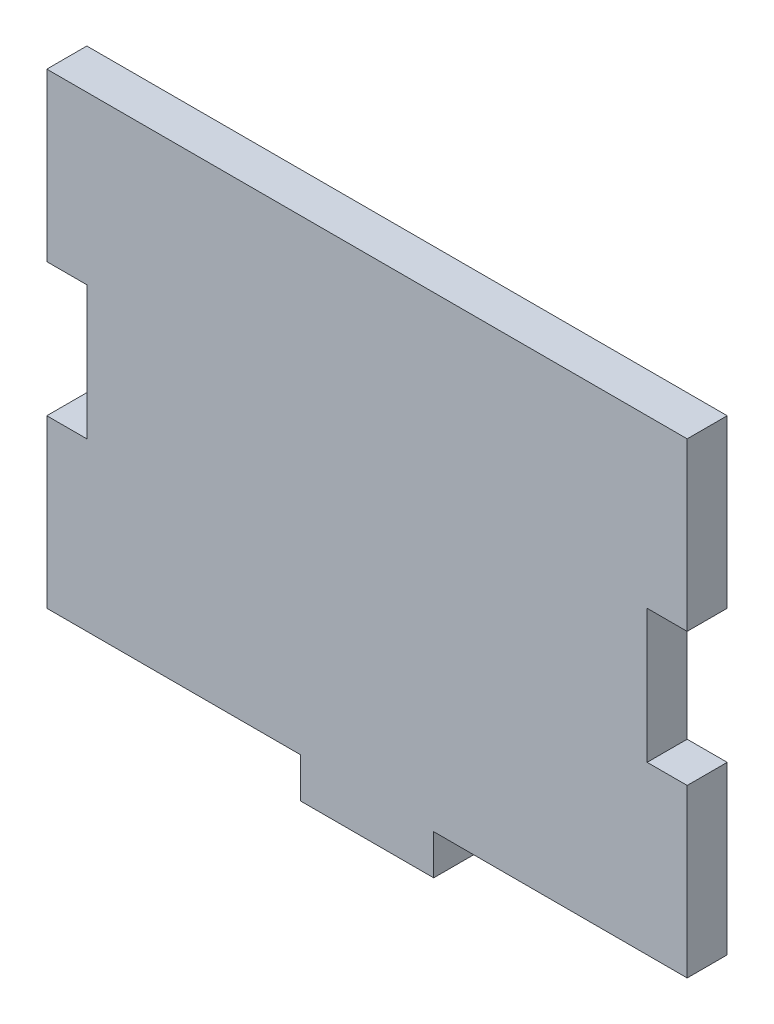
ISO-10303-21;
HEADER;
FILE_DESCRIPTION(('STEP AP214'),'2;1');
FILE_NAME('part.step','',(''),(''),'','','');
FILE_SCHEMA(('AUTOMOTIVE_DESIGN { 1 0 10303 214 1 1 1 1 }'));
ENDSEC;
DATA;
#1=APPLICATION_CONTEXT('core data for automotive mechanical design processes');
#2=APPLICATION_PROTOCOL_DEFINITION('international standard','automotive_design',2000,#1);
#3=PRODUCT_CONTEXT('',#1,'mechanical');
#4=PRODUCT('Part','Part','',(#3));
#5=PRODUCT_RELATED_PRODUCT_CATEGORY('part','',(#4));
#6=PRODUCT_DEFINITION_FORMATION('','',#4);
#7=PRODUCT_DEFINITION_CONTEXT('part definition',#1,'design');
#8=PRODUCT_DEFINITION('design','',#6,#7);
#9=PRODUCT_DEFINITION_SHAPE('','',#8);
#10=(LENGTH_UNIT() NAMED_UNIT(*) SI_UNIT(.MILLI.,.METRE.));
#11=(NAMED_UNIT(*) PLANE_ANGLE_UNIT() SI_UNIT($,.RADIAN.));
#12=(NAMED_UNIT(*) SI_UNIT($,.STERADIAN.) SOLID_ANGLE_UNIT());
#13=UNCERTAINTY_MEASURE_WITH_UNIT(LENGTH_MEASURE(1.E-05),#10,'distance_accuracy_value','');
#14=(GEOMETRIC_REPRESENTATION_CONTEXT(3) GLOBAL_UNCERTAINTY_ASSIGNED_CONTEXT((#13)) GLOBAL_UNIT_ASSIGNED_CONTEXT((#10,
#11,#12)) REPRESENTATION_CONTEXT('',''));
#15=CARTESIAN_POINT('',(0.,0.,0.));
#16=DIRECTION('',(0.,0.,1.));
#17=DIRECTION('',(1.,0.,0.));
#18=AXIS2_PLACEMENT_3D('',#15,#16,#17);
#19=CARTESIAN_POINT('',(-24.,5.00000000000001,3.));
#20=DIRECTION('',(1.,0.,0.));
#21=DIRECTION('',(0.,0.,-1.));
#22=AXIS2_PLACEMENT_3D('',#19,#20,#21);
#23=PLANE('',#22);
#24=DIRECTION('',(0.,-1.,0.));
#25=VECTOR('',#24,1.);
#26=CARTESIAN_POINT('',(-24.,5.00000000000001,0.));
#27=LINE('',#26,#25);
#28=CARTESIAN_POINT('',(-24.,17.5,0.));
#29=VERTEX_POINT('',#28);
#30=CARTESIAN_POINT('',(-24.,5.00000000000001,0.));
#31=VERTEX_POINT('',#30);
#32=EDGE_CURVE('E176',#29,#31,#27,.T.);
#33=ORIENTED_EDGE('',*,*,#32,.T.);
#34=DIRECTION('',(0.,0.,-1.));
#35=VECTOR('',#34,1.);
#36=CARTESIAN_POINT('',(-24.,5.00000000000001,3.));
#37=LINE('',#36,#35);
#38=CARTESIAN_POINT('',(-24.,5.00000000000001,3.));
#39=VERTEX_POINT('',#38);
#40=EDGE_CURVE('E11',#39,#31,#37,.T.);
#41=ORIENTED_EDGE('',*,*,#40,.F.);
#42=DIRECTION('',(0.,-1.,0.));
#43=VECTOR('',#42,1.);
#44=CARTESIAN_POINT('',(-24.,5.00000000000001,3.));
#45=LINE('',#44,#43);
#46=CARTESIAN_POINT('',(-24.,17.5,3.));
#47=VERTEX_POINT('',#46);
#48=EDGE_CURVE('E206',#47,#39,#45,.T.);
#49=ORIENTED_EDGE('',*,*,#48,.F.);
#50=DIRECTION('',(0.,0.,-1.));
#51=VECTOR('',#50,1.);
#52=CARTESIAN_POINT('',(-24.,17.5,3.));
#53=LINE('',#52,#51);
#54=EDGE_CURVE('E172',#47,#29,#53,.T.);
#55=ORIENTED_EDGE('',*,*,#54,.T.);
#56=EDGE_LOOP('',(#33,#41,#49,#55));
#57=FACE_BOUND('',#56,.T.);
#58=ADVANCED_FACE('F32',(#57),#23,.F.);
#59=CARTESIAN_POINT('',(-21.,5.00000000000001,3.));
#60=DIRECTION('',(0.,1.,0.));
#61=DIRECTION('',(0.,0.,1.));
#62=AXIS2_PLACEMENT_3D('',#59,#60,#61);
#63=PLANE('',#62);
#64=DIRECTION('',(1.,0.,0.));
#65=VECTOR('',#64,1.);
#66=CARTESIAN_POINT('',(-21.,5.00000000000001,0.));
#67=LINE('',#66,#65);
#68=CARTESIAN_POINT('',(-21.,5.00000000000001,0.));
#69=VERTEX_POINT('',#68);
#70=EDGE_CURVE('E179',#31,#69,#67,.T.);
#71=ORIENTED_EDGE('',*,*,#70,.T.);
#72=DIRECTION('',(0.,0.,-1.));
#73=VECTOR('',#72,1.);
#74=CARTESIAN_POINT('',(-21.,5.00000000000001,3.));
#75=LINE('',#74,#73);
#76=CARTESIAN_POINT('',(-21.,5.00000000000001,3.));
#77=VERTEX_POINT('',#76);
#78=EDGE_CURVE('E40',#77,#69,#75,.T.);
#79=ORIENTED_EDGE('',*,*,#78,.F.);
#80=DIRECTION('',(1.,0.,0.));
#81=VECTOR('',#80,1.);
#82=CARTESIAN_POINT('',(-21.,5.00000000000001,3.));
#83=LINE('',#82,#81);
#84=EDGE_CURVE('E115',#39,#77,#83,.T.);
#85=ORIENTED_EDGE('',*,*,#84,.F.);
#86=ORIENTED_EDGE('',*,*,#40,.T.);
#87=EDGE_LOOP('',(#71,#79,#85,#86));
#88=FACE_BOUND('',#87,.T.);
#89=ADVANCED_FACE('F304',(#88),#63,.F.);
#90=CARTESIAN_POINT('',(-21.,-4.99999999999999,3.));
#91=DIRECTION('',(1.,0.,0.));
#92=DIRECTION('',(0.,0.,-1.));
#93=AXIS2_PLACEMENT_3D('',#90,#91,#92);
#94=PLANE('',#93);
#95=DIRECTION('',(0.,-1.,0.));
#96=VECTOR('',#95,1.);
#97=CARTESIAN_POINT('',(-21.,-4.99999999999999,0.));
#98=LINE('',#97,#96);
#99=CARTESIAN_POINT('',(-21.,-4.99999999999999,0.));
#100=VERTEX_POINT('',#99);
#101=EDGE_CURVE('E181',#69,#100,#98,.T.);
#102=ORIENTED_EDGE('',*,*,#101,.T.);
#103=DIRECTION('',(0.,0.,-1.));
#104=VECTOR('',#103,1.);
#105=CARTESIAN_POINT('',(-21.,-4.99999999999999,3.));
#106=LINE('',#105,#104);
#107=CARTESIAN_POINT('',(-21.,-4.99999999999999,3.));
#108=VERTEX_POINT('',#107);
#109=EDGE_CURVE('E237',#108,#100,#106,.T.);
#110=ORIENTED_EDGE('',*,*,#109,.F.);
#111=DIRECTION('',(0.,-1.,0.));
#112=VECTOR('',#111,1.);
#113=CARTESIAN_POINT('',(-21.,-4.99999999999999,3.));
#114=LINE('',#113,#112);
#115=EDGE_CURVE('E245',#77,#108,#114,.T.);
#116=ORIENTED_EDGE('',*,*,#115,.F.);
#117=ORIENTED_EDGE('',*,*,#78,.T.);
#118=EDGE_LOOP('',(#102,#110,#116,#117));
#119=FACE_BOUND('',#118,.T.);
#120=ADVANCED_FACE('F243',(#119),#94,.F.);
#121=CARTESIAN_POINT('',(-24.,-4.99999999999999,3.));
#122=DIRECTION('',(0.,-1.,0.));
#123=DIRECTION('',(1.,0.,0.));
#124=AXIS2_PLACEMENT_3D('',#121,#122,#123);
#125=PLANE('',#124);
#126=DIRECTION('',(-1.,0.,0.));
#127=VECTOR('',#126,1.);
#128=CARTESIAN_POINT('',(-24.,-4.99999999999999,0.));
#129=LINE('',#128,#127);
#130=CARTESIAN_POINT('',(-24.,-4.99999999999999,0.));
#131=VERTEX_POINT('',#130);
#132=EDGE_CURVE('E183',#100,#131,#129,.T.);
#133=ORIENTED_EDGE('',*,*,#132,.T.);
#134=DIRECTION('',(0.,0.,-1.));
#135=VECTOR('',#134,1.);
#136=CARTESIAN_POINT('',(-24.,-4.99999999999999,3.));
#137=LINE('',#136,#135);
#138=CARTESIAN_POINT('',(-24.,-4.99999999999999,3.));
#139=VERTEX_POINT('',#138);
#140=EDGE_CURVE('E234',#139,#131,#137,.T.);
#141=ORIENTED_EDGE('',*,*,#140,.F.);
#142=DIRECTION('',(-1.,0.,0.));
#143=VECTOR('',#142,1.);
#144=CARTESIAN_POINT('',(-24.,-4.99999999999999,3.));
#145=LINE('',#144,#143);
#146=EDGE_CURVE('E263',#108,#139,#145,.T.);
#147=ORIENTED_EDGE('',*,*,#146,.F.);
#148=ORIENTED_EDGE('',*,*,#109,.T.);
#149=EDGE_LOOP('',(#133,#141,#147,#148));
#150=FACE_BOUND('',#149,.T.);
#151=ADVANCED_FACE('F254',(#150),#125,.F.);
#152=CARTESIAN_POINT('',(-24.,-17.5,3.));
#153=DIRECTION('',(1.,0.,0.));
#154=DIRECTION('',(0.,0.,-1.));
#155=AXIS2_PLACEMENT_3D('',#152,#153,#154);
#156=PLANE('',#155);
#157=DIRECTION('',(0.,-1.,0.));
#158=VECTOR('',#157,1.);
#159=CARTESIAN_POINT('',(-24.,-17.5,0.));
#160=LINE('',#159,#158);
#161=CARTESIAN_POINT('',(-24.,-17.5,0.));
#162=VERTEX_POINT('',#161);
#163=EDGE_CURVE('E185',#131,#162,#160,.T.);
#164=ORIENTED_EDGE('',*,*,#163,.T.);
#165=DIRECTION('',(0.,0.,-1.));
#166=VECTOR('',#165,1.);
#167=CARTESIAN_POINT('',(-24.,-17.5,3.));
#168=LINE('',#167,#166);
#169=CARTESIAN_POINT('',(-24.,-17.5,3.));
#170=VERTEX_POINT('',#169);
#171=EDGE_CURVE('E231',#170,#162,#168,.T.);
#172=ORIENTED_EDGE('',*,*,#171,.F.);
#173=DIRECTION('',(0.,-1.,0.));
#174=VECTOR('',#173,1.);
#175=CARTESIAN_POINT('',(-24.,-17.5,3.));
#176=LINE('',#175,#174);
#177=EDGE_CURVE('E260',#139,#170,#176,.T.);
#178=ORIENTED_EDGE('',*,*,#177,.F.);
#179=ORIENTED_EDGE('',*,*,#140,.T.);
#180=EDGE_LOOP('',(#164,#172,#178,#179));
#181=FACE_BOUND('',#180,.T.);
#182=ADVANCED_FACE('F258',(#181),#156,.F.);
#183=CARTESIAN_POINT('',(-5.,-17.5,3.));
#184=DIRECTION('',(0.,1.,0.));
#185=DIRECTION('',(-1.,0.,0.));
#186=AXIS2_PLACEMENT_3D('',#183,#184,#185);
#187=PLANE('',#186);
#188=DIRECTION('',(1.,0.,0.));
#189=VECTOR('',#188,1.);
#190=CARTESIAN_POINT('',(-5.,-17.5,0.));
#191=LINE('',#190,#189);
#192=CARTESIAN_POINT('',(-5.,-17.5,0.));
#193=VERTEX_POINT('',#192);
#194=EDGE_CURVE('E187',#162,#193,#191,.T.);
#195=ORIENTED_EDGE('',*,*,#194,.T.);
#196=DIRECTION('',(0.,0.,-1.));
#197=VECTOR('',#196,1.);
#198=CARTESIAN_POINT('',(-5.,-17.5,3.));
#199=LINE('',#198,#197);
#200=CARTESIAN_POINT('',(-5.,-17.5,3.));
#201=VERTEX_POINT('',#200);
#202=EDGE_CURVE('E228',#201,#193,#199,.T.);
#203=ORIENTED_EDGE('',*,*,#202,.F.);
#204=DIRECTION('',(1.,0.,0.));
#205=VECTOR('',#204,1.);
#206=CARTESIAN_POINT('',(-5.,-17.5,3.));
#207=LINE('',#206,#205);
#208=EDGE_CURVE('E262',#170,#201,#207,.T.);
#209=ORIENTED_EDGE('',*,*,#208,.F.);
#210=ORIENTED_EDGE('',*,*,#171,.T.);
#211=EDGE_LOOP('',(#195,#203,#209,#210));
#212=FACE_BOUND('',#211,.T.);
#213=ADVANCED_FACE('F317',(#212),#187,.F.);
#214=CARTESIAN_POINT('',(-5.,-17.5,3.));
#215=DIRECTION('',(1.,0.,0.));
#216=DIRECTION('',(0.,0.,-1.));
#217=AXIS2_PLACEMENT_3D('',#214,#215,#216);
#218=PLANE('',#217);
#219=DIRECTION('',(0.,-1.,0.));
#220=VECTOR('',#219,1.);
#221=CARTESIAN_POINT('',(-5.,-17.5,0.));
#222=LINE('',#221,#220);
#223=CARTESIAN_POINT('',(-5.,-20.5,0.));
#224=VERTEX_POINT('',#223);
#225=EDGE_CURVE('E189',#193,#224,#222,.T.);
#226=ORIENTED_EDGE('',*,*,#225,.T.);
#227=DIRECTION('',(0.,0.,-1.));
#228=VECTOR('',#227,1.);
#229=CARTESIAN_POINT('',(-5.,-20.5,3.));
#230=LINE('',#229,#228);
#231=CARTESIAN_POINT('',(-5.,-20.5,3.));
#232=VERTEX_POINT('',#231);
#233=EDGE_CURVE('E225',#232,#224,#230,.T.);
#234=ORIENTED_EDGE('',*,*,#233,.F.);
#235=DIRECTION('',(0.,-1.,0.));
#236=VECTOR('',#235,1.);
#237=CARTESIAN_POINT('',(-5.,-17.5,3.));
#238=LINE('',#237,#236);
#239=EDGE_CURVE('E265',#201,#232,#238,.T.);
#240=ORIENTED_EDGE('',*,*,#239,.F.);
#241=ORIENTED_EDGE('',*,*,#202,.T.);
#242=EDGE_LOOP('',(#226,#234,#240,#241));
#243=FACE_BOUND('',#242,.T.);
#244=ADVANCED_FACE('F320',(#243),#218,.F.);
#245=CARTESIAN_POINT('',(-5.,-20.5,3.));
#246=DIRECTION('',(0.,1.,0.));
#247=DIRECTION('',(0.,0.,1.));
#248=AXIS2_PLACEMENT_3D('',#245,#246,#247);
#249=PLANE('',#248);
#250=DIRECTION('',(1.,0.,0.));
#251=VECTOR('',#250,1.);
#252=CARTESIAN_POINT('',(-5.,-20.5,0.));
#253=LINE('',#252,#251);
#254=CARTESIAN_POINT('',(5.,-20.5,0.));
#255=VERTEX_POINT('',#254);
#256=EDGE_CURVE('E191',#224,#255,#253,.T.);
#257=ORIENTED_EDGE('',*,*,#256,.T.);
#258=DIRECTION('',(0.,0.,-1.));
#259=VECTOR('',#258,1.);
#260=CARTESIAN_POINT('',(5.,-20.5,3.));
#261=LINE('',#260,#259);
#262=CARTESIAN_POINT('',(5.,-20.5,3.));
#263=VERTEX_POINT('',#262);
#264=EDGE_CURVE('E222',#263,#255,#261,.T.);
#265=ORIENTED_EDGE('',*,*,#264,.F.);
#266=DIRECTION('',(1.,0.,0.));
#267=VECTOR('',#266,1.);
#268=CARTESIAN_POINT('',(-5.,-20.5,3.));
#269=LINE('',#268,#267);
#270=EDGE_CURVE('E271',#232,#263,#269,.T.);
#271=ORIENTED_EDGE('',*,*,#270,.F.);
#272=ORIENTED_EDGE('',*,*,#233,.T.);
#273=EDGE_LOOP('',(#257,#265,#271,#272));
#274=FACE_BOUND('',#273,.T.);
#275=ADVANCED_FACE('F324',(#274),#249,.F.);
#276=CARTESIAN_POINT('',(5.,-20.5,3.));
#277=DIRECTION('',(-1.,0.,0.));
#278=DIRECTION('',(0.,0.,1.));
#279=AXIS2_PLACEMENT_3D('',#276,#277,#278);
#280=PLANE('',#279);
#281=DIRECTION('',(0.,1.,0.));
#282=VECTOR('',#281,1.);
#283=CARTESIAN_POINT('',(5.,-20.5,0.));
#284=LINE('',#283,#282);
#285=CARTESIAN_POINT('',(5.,-17.5,0.));
#286=VERTEX_POINT('',#285);
#287=EDGE_CURVE('E193',#255,#286,#284,.T.);
#288=ORIENTED_EDGE('',*,*,#287,.T.);
#289=DIRECTION('',(0.,0.,-1.));
#290=VECTOR('',#289,1.);
#291=CARTESIAN_POINT('',(5.,-17.5,3.));
#292=LINE('',#291,#290);
#293=CARTESIAN_POINT('',(5.,-17.5,3.));
#294=VERTEX_POINT('',#293);
#295=EDGE_CURVE('E219',#294,#286,#292,.T.);
#296=ORIENTED_EDGE('',*,*,#295,.F.);
#297=DIRECTION('',(0.,1.,0.));
#298=VECTOR('',#297,1.);
#299=CARTESIAN_POINT('',(5.,-20.5,3.));
#300=LINE('',#299,#298);
#301=EDGE_CURVE('E273',#263,#294,#300,.T.);
#302=ORIENTED_EDGE('',*,*,#301,.F.);
#303=ORIENTED_EDGE('',*,*,#264,.T.);
#304=EDGE_LOOP('',(#288,#296,#302,#303));
#305=FACE_BOUND('',#304,.T.);
#306=ADVANCED_FACE('F328',(#305),#280,.F.);
#307=CARTESIAN_POINT('',(24.,-17.5,3.));
#308=DIRECTION('',(0.,1.,0.));
#309=DIRECTION('',(-1.,0.,0.));
#310=AXIS2_PLACEMENT_3D('',#307,#308,#309);
#311=PLANE('',#310);
#312=DIRECTION('',(1.,0.,0.));
#313=VECTOR('',#312,1.);
#314=CARTESIAN_POINT('',(24.,-17.5,0.));
#315=LINE('',#314,#313);
#316=CARTESIAN_POINT('',(24.,-17.5,0.));
#317=VERTEX_POINT('',#316);
#318=EDGE_CURVE('E195',#286,#317,#315,.T.);
#319=ORIENTED_EDGE('',*,*,#318,.T.);
#320=DIRECTION('',(0.,0.,-1.));
#321=VECTOR('',#320,1.);
#322=CARTESIAN_POINT('',(24.,-17.5,3.));
#323=LINE('',#322,#321);
#324=CARTESIAN_POINT('',(24.,-17.5,3.));
#325=VERTEX_POINT('',#324);
#326=EDGE_CURVE('E216',#325,#317,#323,.T.);
#327=ORIENTED_EDGE('',*,*,#326,.F.);
#328=DIRECTION('',(1.,0.,0.));
#329=VECTOR('',#328,1.);
#330=CARTESIAN_POINT('',(24.,-17.5,3.));
#331=LINE('',#330,#329);
#332=EDGE_CURVE('E275',#294,#325,#331,.T.);
#333=ORIENTED_EDGE('',*,*,#332,.F.);
#334=ORIENTED_EDGE('',*,*,#295,.T.);
#335=EDGE_LOOP('',(#319,#327,#333,#334));
#336=FACE_BOUND('',#335,.T.);
#337=ADVANCED_FACE('F332',(#336),#311,.F.);
#338=CARTESIAN_POINT('',(24.,-17.5,3.));
#339=DIRECTION('',(-1.,0.,0.));
#340=DIRECTION('',(0.,0.,1.));
#341=AXIS2_PLACEMENT_3D('',#338,#339,#340);
#342=PLANE('',#341);
#343=DIRECTION('',(0.,1.,0.));
#344=VECTOR('',#343,1.);
#345=CARTESIAN_POINT('',(24.,-17.5,0.));
#346=LINE('',#345,#344);
#347=CARTESIAN_POINT('',(24.,-4.99999999999999,0.));
#348=VERTEX_POINT('',#347);
#349=EDGE_CURVE('E197',#317,#348,#346,.T.);
#350=ORIENTED_EDGE('',*,*,#349,.T.);
#351=DIRECTION('',(0.,0.,-1.));
#352=VECTOR('',#351,1.);
#353=CARTESIAN_POINT('',(24.,-4.99999999999999,3.));
#354=LINE('',#353,#352);
#355=CARTESIAN_POINT('',(24.,-4.99999999999999,3.));
#356=VERTEX_POINT('',#355);
#357=EDGE_CURVE('E213',#356,#348,#354,.T.);
#358=ORIENTED_EDGE('',*,*,#357,.F.);
#359=DIRECTION('',(0.,1.,0.));
#360=VECTOR('',#359,1.);
#361=CARTESIAN_POINT('',(24.,-17.5,3.));
#362=LINE('',#361,#360);
#363=EDGE_CURVE('E277',#325,#356,#362,.T.);
#364=ORIENTED_EDGE('',*,*,#363,.F.);
#365=ORIENTED_EDGE('',*,*,#326,.T.);
#366=EDGE_LOOP('',(#350,#358,#364,#365));
#367=FACE_BOUND('',#366,.T.);
#368=ADVANCED_FACE('F336',(#367),#342,.F.);
#369=CARTESIAN_POINT('',(24.,-4.99999999999999,3.));
#370=DIRECTION('',(0.,-1.,0.));
#371=DIRECTION('',(1.,0.,0.));
#372=AXIS2_PLACEMENT_3D('',#369,#370,#371);
#373=PLANE('',#372);
#374=DIRECTION('',(-1.,0.,0.));
#375=VECTOR('',#374,1.);
#376=CARTESIAN_POINT('',(24.,-4.99999999999999,0.));
#377=LINE('',#376,#375);
#378=CARTESIAN_POINT('',(21.,-4.99999999999999,0.));
#379=VERTEX_POINT('',#378);
#380=EDGE_CURVE('E199',#348,#379,#377,.T.);
#381=ORIENTED_EDGE('',*,*,#380,.T.);
#382=DIRECTION('',(0.,0.,-1.));
#383=VECTOR('',#382,1.);
#384=CARTESIAN_POINT('',(21.,-4.99999999999999,3.));
#385=LINE('',#384,#383);
#386=CARTESIAN_POINT('',(21.,-4.99999999999999,3.));
#387=VERTEX_POINT('',#386);
#388=EDGE_CURVE('E210',#387,#379,#385,.T.);
#389=ORIENTED_EDGE('',*,*,#388,.F.);
#390=DIRECTION('',(-1.,0.,0.));
#391=VECTOR('',#390,1.);
#392=CARTESIAN_POINT('',(24.,-4.99999999999999,3.));
#393=LINE('',#392,#391);
#394=EDGE_CURVE('E279',#356,#387,#393,.T.);
#395=ORIENTED_EDGE('',*,*,#394,.F.);
#396=ORIENTED_EDGE('',*,*,#357,.T.);
#397=EDGE_LOOP('',(#381,#389,#395,#396));
#398=FACE_BOUND('',#397,.T.);
#399=ADVANCED_FACE('F285',(#398),#373,.F.);
#400=CARTESIAN_POINT('',(21.,-4.99999999999999,3.));
#401=DIRECTION('',(-1.,0.,0.));
#402=DIRECTION('',(0.,0.,1.));
#403=AXIS2_PLACEMENT_3D('',#400,#401,#402);
#404=PLANE('',#403);
#405=DIRECTION('',(0.,1.,0.));
#406=VECTOR('',#405,1.);
#407=CARTESIAN_POINT('',(21.,-4.99999999999999,0.));
#408=LINE('',#407,#406);
#409=CARTESIAN_POINT('',(21.,5.00000000000001,0.));
#410=VERTEX_POINT('',#409);
#411=EDGE_CURVE('E201',#379,#410,#408,.T.);
#412=ORIENTED_EDGE('',*,*,#411,.T.);
#413=DIRECTION('',(0.,0.,-1.));
#414=VECTOR('',#413,1.);
#415=CARTESIAN_POINT('',(21.,5.00000000000001,3.));
#416=LINE('',#415,#414);
#417=CARTESIAN_POINT('',(21.,5.00000000000001,3.));
#418=VERTEX_POINT('',#417);
#419=EDGE_CURVE('E167',#418,#410,#416,.T.);
#420=ORIENTED_EDGE('',*,*,#419,.F.);
#421=DIRECTION('',(0.,1.,0.));
#422=VECTOR('',#421,1.);
#423=CARTESIAN_POINT('',(21.,-4.99999999999999,3.));
#424=LINE('',#423,#422);
#425=EDGE_CURVE('E158',#387,#418,#424,.T.);
#426=ORIENTED_EDGE('',*,*,#425,.F.);
#427=ORIENTED_EDGE('',*,*,#388,.T.);
#428=EDGE_LOOP('',(#412,#420,#426,#427));
#429=FACE_BOUND('',#428,.T.);
#430=ADVANCED_FACE('F289',(#429),#404,.F.);
#431=CARTESIAN_POINT('',(21.,5.00000000000001,3.));
#432=DIRECTION('',(0.,1.,0.));
#433=DIRECTION('',(0.,0.,1.));
#434=AXIS2_PLACEMENT_3D('',#431,#432,#433);
#435=PLANE('',#434);
#436=DIRECTION('',(1.,0.,0.));
#437=VECTOR('',#436,1.);
#438=CARTESIAN_POINT('',(21.,5.00000000000001,0.));
#439=LINE('',#438,#437);
#440=CARTESIAN_POINT('',(24.,5.00000000000001,0.));
#441=VERTEX_POINT('',#440);
#442=EDGE_CURVE('E166',#410,#441,#439,.T.);
#443=ORIENTED_EDGE('',*,*,#442,.T.);
#444=DIRECTION('',(0.,0.,-1.));
#445=VECTOR('',#444,1.);
#446=CARTESIAN_POINT('',(24.,5.00000000000001,3.));
#447=LINE('',#446,#445);
#448=CARTESIAN_POINT('',(24.,5.00000000000001,3.));
#449=VERTEX_POINT('',#448);
#450=EDGE_CURVE('E163',#449,#441,#447,.T.);
#451=ORIENTED_EDGE('',*,*,#450,.F.);
#452=DIRECTION('',(1.,0.,0.));
#453=VECTOR('',#452,1.);
#454=CARTESIAN_POINT('',(21.,5.00000000000001,3.));
#455=LINE('',#454,#453);
#456=EDGE_CURVE('E152',#418,#449,#455,.T.);
#457=ORIENTED_EDGE('',*,*,#456,.F.);
#458=ORIENTED_EDGE('',*,*,#419,.T.);
#459=EDGE_LOOP('',(#443,#451,#457,#458));
#460=FACE_BOUND('',#459,.T.);
#461=ADVANCED_FACE('F164',(#460),#435,.F.);
#462=CARTESIAN_POINT('',(24.,5.00000000000001,3.));
#463=DIRECTION('',(-1.,0.,0.));
#464=DIRECTION('',(0.,0.,1.));
#465=AXIS2_PLACEMENT_3D('',#462,#463,#464);
#466=PLANE('',#465);
#467=DIRECTION('',(0.,1.,0.));
#468=VECTOR('',#467,1.);
#469=CARTESIAN_POINT('',(24.,5.00000000000001,0.));
#470=LINE('',#469,#468);
#471=CARTESIAN_POINT('',(24.,17.5,0.));
#472=VERTEX_POINT('',#471);
#473=EDGE_CURVE('E101',#441,#472,#470,.T.);
#474=ORIENTED_EDGE('',*,*,#473,.T.);
#475=DIRECTION('',(0.,0.,-1.));
#476=VECTOR('',#475,1.);
#477=CARTESIAN_POINT('',(24.,17.5,3.));
#478=LINE('',#477,#476);
#479=CARTESIAN_POINT('',(24.,17.5,3.));
#480=VERTEX_POINT('',#479);
#481=EDGE_CURVE('E168',#480,#472,#478,.T.);
#482=ORIENTED_EDGE('',*,*,#481,.F.);
#483=DIRECTION('',(0.,1.,0.));
#484=VECTOR('',#483,1.);
#485=CARTESIAN_POINT('',(24.,5.00000000000001,3.));
#486=LINE('',#485,#484);
#487=EDGE_CURVE('E156',#449,#480,#486,.T.);
#488=ORIENTED_EDGE('',*,*,#487,.F.);
#489=ORIENTED_EDGE('',*,*,#450,.T.);
#490=EDGE_LOOP('',(#474,#482,#488,#489));
#491=FACE_BOUND('',#490,.T.);
#492=ADVANCED_FACE('F170',(#491),#466,.F.);
#493=CARTESIAN_POINT('',(24.,17.5,3.));
#494=DIRECTION('',(0.,-1.,0.));
#495=DIRECTION('',(0.,0.,-1.));
#496=AXIS2_PLACEMENT_3D('',#493,#494,#495);
#497=PLANE('',#496);
#498=DIRECTION('',(-1.,0.,0.));
#499=VECTOR('',#498,1.);
#500=CARTESIAN_POINT('',(24.,17.5,0.));
#501=LINE('',#500,#499);
#502=EDGE_CURVE('E107',#472,#29,#501,.T.);
#503=ORIENTED_EDGE('',*,*,#502,.T.);
#504=ORIENTED_EDGE('',*,*,#54,.F.);
#505=DIRECTION('',(-1.,0.,0.));
#506=VECTOR('',#505,1.);
#507=CARTESIAN_POINT('',(24.,17.5,3.));
#508=LINE('',#507,#506);
#509=EDGE_CURVE('E48',#480,#47,#508,.T.);
#510=ORIENTED_EDGE('',*,*,#509,.F.);
#511=ORIENTED_EDGE('',*,*,#481,.T.);
#512=EDGE_LOOP('',(#503,#504,#510,#511));
#513=FACE_BOUND('',#512,.T.);
#514=ADVANCED_FACE('F293',(#513),#497,.F.);
#515=CARTESIAN_POINT('',(0.,0.,3.));
#516=DIRECTION('',(0.,0.,1.));
#517=DIRECTION('',(1.,0.,0.));
#518=AXIS2_PLACEMENT_3D('',#515,#516,#517);
#519=PLANE('',#518);
#520=ORIENTED_EDGE('',*,*,#48,.T.);
#521=ORIENTED_EDGE('',*,*,#84,.T.);
#522=ORIENTED_EDGE('',*,*,#115,.T.);
#523=ORIENTED_EDGE('',*,*,#146,.T.);
#524=ORIENTED_EDGE('',*,*,#177,.T.);
#525=ORIENTED_EDGE('',*,*,#208,.T.);
#526=ORIENTED_EDGE('',*,*,#239,.T.);
#527=ORIENTED_EDGE('',*,*,#270,.T.);
#528=ORIENTED_EDGE('',*,*,#301,.T.);
#529=ORIENTED_EDGE('',*,*,#332,.T.);
#530=ORIENTED_EDGE('',*,*,#363,.T.);
#531=ORIENTED_EDGE('',*,*,#394,.T.);
#532=ORIENTED_EDGE('',*,*,#425,.T.);
#533=ORIENTED_EDGE('',*,*,#456,.T.);
#534=ORIENTED_EDGE('',*,*,#487,.T.);
#535=ORIENTED_EDGE('',*,*,#509,.T.);
#536=EDGE_LOOP('',(#520,#521,#522,#523,#524,#525,#526,#527,#528,#529,#530,#531,#532,#533,#534,#535));
#537=FACE_BOUND('',#536,.T.);
#538=ADVANCED_FACE('F154',(#537),#519,.T.);
#539=CARTESIAN_POINT('',(0.,0.,0.));
#540=DIRECTION('',(0.,0.,1.));
#541=DIRECTION('',(1.,0.,0.));
#542=AXIS2_PLACEMENT_3D('',#539,#540,#541);
#543=PLANE('',#542);
#544=ORIENTED_EDGE('',*,*,#32,.F.);
#545=ORIENTED_EDGE('',*,*,#502,.F.);
#546=ORIENTED_EDGE('',*,*,#473,.F.);
#547=ORIENTED_EDGE('',*,*,#442,.F.);
#548=ORIENTED_EDGE('',*,*,#411,.F.);
#549=ORIENTED_EDGE('',*,*,#380,.F.);
#550=ORIENTED_EDGE('',*,*,#349,.F.);
#551=ORIENTED_EDGE('',*,*,#318,.F.);
#552=ORIENTED_EDGE('',*,*,#287,.F.);
#553=ORIENTED_EDGE('',*,*,#256,.F.);
#554=ORIENTED_EDGE('',*,*,#225,.F.);
#555=ORIENTED_EDGE('',*,*,#194,.F.);
#556=ORIENTED_EDGE('',*,*,#163,.F.);
#557=ORIENTED_EDGE('',*,*,#132,.F.);
#558=ORIENTED_EDGE('',*,*,#101,.F.);
#559=ORIENTED_EDGE('',*,*,#70,.F.);
#560=EDGE_LOOP('',(#544,#545,#546,#547,#548,#549,#550,#551,#552,#553,#554,#555,#556,#557,#558,#559));
#561=FACE_BOUND('',#560,.T.);
#562=ADVANCED_FACE('F249',(#561),#543,.F.);
#563=CLOSED_SHELL('',(#58,#89,#120,#151,#182,#213,#244,#275,#306,#337,#368,#399,#430,#461,#492,
#514,#538,#562));
#564=MANIFOLD_SOLID_BREP('B2',#563);
#565=ADVANCED_BREP_SHAPE_REPRESENTATION('',(#18,#564),#14);
#566=SHAPE_DEFINITION_REPRESENTATION(#9,#565);
ENDSEC;
END-ISO-10303-21;
